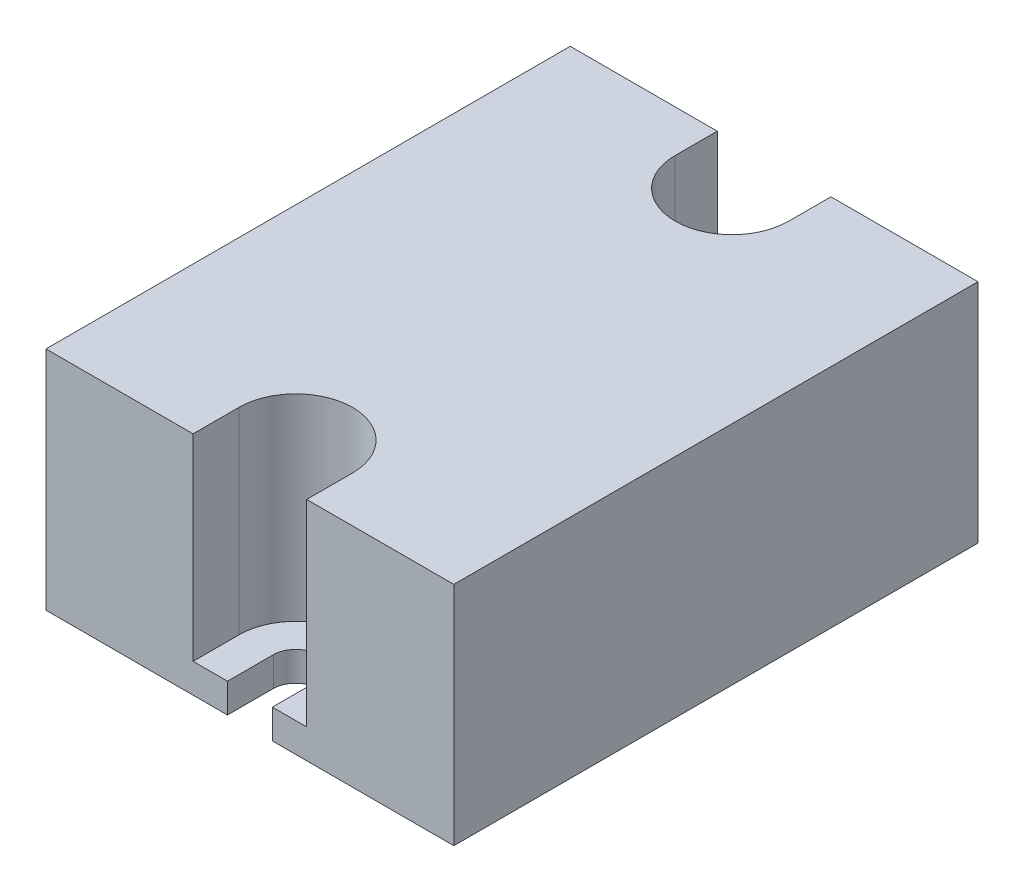
ISO-10303-21;
HEADER;
FILE_DESCRIPTION(('STEP AP214'),'2;1');
FILE_NAME('part.step','',(''),(''),'','','');
FILE_SCHEMA(('AUTOMOTIVE_DESIGN { 1 0 10303 214 1 1 1 1 }'));
ENDSEC;
DATA;
#1=APPLICATION_CONTEXT('core data for automotive mechanical design processes');
#2=APPLICATION_PROTOCOL_DEFINITION('international standard','automotive_design',2000,#1);
#3=PRODUCT_CONTEXT('',#1,'mechanical');
#4=PRODUCT('Part','Part','',(#3));
#5=PRODUCT_RELATED_PRODUCT_CATEGORY('part','',(#4));
#6=PRODUCT_DEFINITION_FORMATION('','',#4);
#7=PRODUCT_DEFINITION_CONTEXT('part definition',#1,'design');
#8=PRODUCT_DEFINITION('design','',#6,#7);
#9=PRODUCT_DEFINITION_SHAPE('','',#8);
#10=(LENGTH_UNIT() NAMED_UNIT(*) SI_UNIT(.MILLI.,.METRE.));
#11=(NAMED_UNIT(*) PLANE_ANGLE_UNIT() SI_UNIT($,.RADIAN.));
#12=(NAMED_UNIT(*) SI_UNIT($,.STERADIAN.) SOLID_ANGLE_UNIT());
#13=UNCERTAINTY_MEASURE_WITH_UNIT(LENGTH_MEASURE(1.E-05),#10,'distance_accuracy_value','');
#14=(GEOMETRIC_REPRESENTATION_CONTEXT(3) GLOBAL_UNCERTAINTY_ASSIGNED_CONTEXT((#13)) GLOBAL_UNIT_ASSIGNED_CONTEXT((#10,
#11,#12)) REPRESENTATION_CONTEXT('',''));
#15=CARTESIAN_POINT('',(0.,0.,0.));
#16=DIRECTION('',(0.,0.,1.));
#17=DIRECTION('',(1.,0.,0.));
#18=AXIS2_PLACEMENT_3D('',#15,#16,#17);
#19=CARTESIAN_POINT('',(22.25,3.19999999999998,-4.99999999999995));
#20=DIRECTION('',(0.,1.,0.));
#21=DIRECTION('',(0.,0.,1.));
#22=AXIS2_PLACEMENT_3D('',#19,#20,#21);
#23=PLANE('',#22);
#24=DIRECTION('',(0.,0.,-1.));
#25=VECTOR('',#24,1.);
#26=CARTESIAN_POINT('',(16.05,3.19999999999998,-57.2));
#27=LINE('',#26,#25);
#28=CARTESIAN_POINT('',(16.05,3.20000000000001,-52.6));
#29=VERTEX_POINT('',#28);
#30=CARTESIAN_POINT('',(16.05,3.19999999999998,-57.2));
#31=VERTEX_POINT('',#30);
#32=EDGE_CURVE('E60',#29,#31,#27,.T.);
#33=ORIENTED_EDGE('',*,*,#32,.F.);
#34=CARTESIAN_POINT('',(22.25,3.20000000000001,-52.5999999999999));
#35=DIRECTION('',(0.,-1.,0.));
#36=DIRECTION('',(0.,0.,1.));
#37=AXIS2_PLACEMENT_3D('',#34,#35,#36);
#38=CIRCLE('',#37,6.2);
#39=CARTESIAN_POINT('',(28.45,3.19999999999998,-52.6));
#40=VERTEX_POINT('',#39);
#41=EDGE_CURVE('E64',#40,#29,#38,.T.);
#42=ORIENTED_EDGE('',*,*,#41,.F.);
#43=DIRECTION('',(0.,0.,1.));
#44=VECTOR('',#43,1.);
#45=CARTESIAN_POINT('',(28.45,3.20000000000001,-57.2));
#46=LINE('',#45,#44);
#47=CARTESIAN_POINT('',(28.45,3.20000000000001,-57.2));
#48=VERTEX_POINT('',#47);
#49=EDGE_CURVE('E273',#48,#40,#46,.T.);
#50=ORIENTED_EDGE('',*,*,#49,.F.);
#51=DIRECTION('',(-1.,0.,0.));
#52=VECTOR('',#51,1.);
#53=CARTESIAN_POINT('',(44.5,3.19999999999998,-57.2));
#54=LINE('',#53,#52);
#55=EDGE_CURVE('E203',#48,#31,#54,.T.);
#56=ORIENTED_EDGE('',*,*,#55,.T.);
#57=EDGE_LOOP('',(#33,#42,#50,#56));
#58=FACE_BOUND('',#57,.T.);
#59=CARTESIAN_POINT('',(22.25,3.20000000000001,-52.5999999999999));
#60=DIRECTION('',(0.,1.,0.));
#61=DIRECTION('',(0.,0.,1.));
#62=AXIS2_PLACEMENT_3D('',#59,#60,#61);
#63=CIRCLE('',#62,2.45);
#64=CARTESIAN_POINT('',(22.25,3.20000000000001,-50.1499999999999));
#65=VERTEX_POINT('',#64);
#66=EDGE_CURVE('E184',#65,#65,#63,.T.);
#67=ORIENTED_EDGE('',*,*,#66,.F.);
#68=EDGE_LOOP('',(#67));
#69=FACE_BOUND('',#68,.T.);
#70=ADVANCED_FACE('F45',(#58,#69),#23,.T.);
#71=DIRECTION('',(0.,0.,1.));
#72=VECTOR('',#71,1.);
#73=CARTESIAN_POINT('',(28.45,3.19999999999998,0.));
#74=LINE('',#73,#72);
#75=CARTESIAN_POINT('',(28.45,3.20000000000001,-5.));
#76=VERTEX_POINT('',#75);
#77=CARTESIAN_POINT('',(28.45,3.19999999999998,0.));
#78=VERTEX_POINT('',#77);
#79=EDGE_CURVE('E267',#76,#78,#74,.T.);
#80=ORIENTED_EDGE('',*,*,#79,.F.);
#81=CARTESIAN_POINT('',(22.25,3.19999999999998,-4.99999999999995));
#82=DIRECTION('',(0.,-1.,0.));
#83=DIRECTION('',(0.,0.,-1.));
#84=AXIS2_PLACEMENT_3D('',#81,#82,#83);
#85=CIRCLE('',#84,6.2);
#86=CARTESIAN_POINT('',(16.05,3.19999999999998,-4.99999999999995));
#87=VERTEX_POINT('',#86);
#88=EDGE_CURVE('E265',#87,#76,#85,.T.);
#89=ORIENTED_EDGE('',*,*,#88,.F.);
#90=DIRECTION('',(0.,0.,-1.));
#91=VECTOR('',#90,1.);
#92=CARTESIAN_POINT('',(16.05,3.20000000000001,0.));
#93=LINE('',#92,#91);
#94=CARTESIAN_POINT('',(16.05,3.20000000000001,0.));
#95=VERTEX_POINT('',#94);
#96=EDGE_CURVE('E263',#95,#87,#93,.T.);
#97=ORIENTED_EDGE('',*,*,#96,.F.);
#98=DIRECTION('',(1.,0.,0.));
#99=VECTOR('',#98,1.);
#100=CARTESIAN_POINT('',(0.,3.20000000000001,0.));
#101=LINE('',#100,#99);
#102=CARTESIAN_POINT('',(19.8,3.20000000000001,0.));
#103=VERTEX_POINT('',#102);
#104=EDGE_CURVE('E180',#95,#103,#101,.T.);
#105=ORIENTED_EDGE('',*,*,#104,.T.);
#106=DIRECTION('',(0.,0.,-1.));
#107=VECTOR('',#106,1.);
#108=CARTESIAN_POINT('',(19.8,3.20000000000001,0.));
#109=LINE('',#108,#107);
#110=CARTESIAN_POINT('',(19.8,3.20000000000001,-4.99999999999995));
#111=VERTEX_POINT('',#110);
#112=EDGE_CURVE('E194',#103,#111,#109,.T.);
#113=ORIENTED_EDGE('',*,*,#112,.T.);
#114=CARTESIAN_POINT('',(22.25,3.19999999999998,-4.99999999999995));
#115=DIRECTION('',(0.,-1.,0.));
#116=DIRECTION('',(0.,0.,1.));
#117=AXIS2_PLACEMENT_3D('',#114,#115,#116);
#118=CIRCLE('',#117,2.45);
#119=CARTESIAN_POINT('',(24.7,3.19999999999998,-4.99999999999995));
#120=VERTEX_POINT('',#119);
#121=EDGE_CURVE('E197',#111,#120,#118,.T.);
#122=ORIENTED_EDGE('',*,*,#121,.T.);
#123=DIRECTION('',(0.,0.,1.));
#124=VECTOR('',#123,1.);
#125=CARTESIAN_POINT('',(24.7,3.20000000000001,0.));
#126=LINE('',#125,#124);
#127=CARTESIAN_POINT('',(24.7,3.20000000000001,0.));
#128=VERTEX_POINT('',#127);
#129=EDGE_CURVE('E199',#120,#128,#126,.T.);
#130=ORIENTED_EDGE('',*,*,#129,.T.);
#131=DIRECTION('',(1.,0.,0.));
#132=VECTOR('',#131,1.);
#133=CARTESIAN_POINT('',(44.5,3.20000000000001,0.));
#134=LINE('',#133,#132);
#135=EDGE_CURVE('E201',#128,#78,#134,.T.);
#136=ORIENTED_EDGE('',*,*,#135,.T.);
#137=EDGE_LOOP('',(#80,#89,#97,#105,#113,#122,#130,#136));
#138=FACE_BOUND('',#137,.T.);
#139=ADVANCED_FACE('F261',(#138),#23,.T.);
#140=CARTESIAN_POINT('',(22.25,0.,-5.));
#141=DIRECTION('',(0.,1.,0.));
#142=DIRECTION('',(0.,0.,1.));
#143=AXIS2_PLACEMENT_3D('',#140,#141,#142);
#144=PLANE('',#143);
#145=DIRECTION('',(0.,0.,1.));
#146=VECTOR('',#145,1.);
#147=CARTESIAN_POINT('',(0.,0.,0.));
#148=LINE('',#147,#146);
#149=CARTESIAN_POINT('',(0.,0.,-57.2));
#150=VERTEX_POINT('',#149);
#151=CARTESIAN_POINT('',(0.,0.,0.));
#152=VERTEX_POINT('',#151);
#153=EDGE_CURVE('E191',#150,#152,#148,.T.);
#154=ORIENTED_EDGE('',*,*,#153,.F.);
#155=DIRECTION('',(-1.,0.,0.));
#156=VECTOR('',#155,1.);
#157=CARTESIAN_POINT('',(0.,0.,-57.2));
#158=LINE('',#157,#156);
#159=CARTESIAN_POINT('',(44.5,0.,-57.2));
#160=VERTEX_POINT('',#159);
#161=EDGE_CURVE('E195',#160,#150,#158,.T.);
#162=ORIENTED_EDGE('',*,*,#161,.F.);
#163=DIRECTION('',(0.,0.,-1.));
#164=VECTOR('',#163,1.);
#165=CARTESIAN_POINT('',(44.5,0.,0.));
#166=LINE('',#165,#164);
#167=CARTESIAN_POINT('',(44.5,0.,0.));
#168=VERTEX_POINT('',#167);
#169=EDGE_CURVE('E218',#168,#160,#166,.T.);
#170=ORIENTED_EDGE('',*,*,#169,.F.);
#171=DIRECTION('',(1.,0.,0.));
#172=VECTOR('',#171,1.);
#173=CARTESIAN_POINT('',(44.5,0.,0.));
#174=LINE('',#173,#172);
#175=CARTESIAN_POINT('',(24.7,0.,0.));
#176=VERTEX_POINT('',#175);
#177=EDGE_CURVE('E216',#176,#168,#174,.T.);
#178=ORIENTED_EDGE('',*,*,#177,.F.);
#179=DIRECTION('',(0.,0.,1.));
#180=VECTOR('',#179,1.);
#181=CARTESIAN_POINT('',(24.7,0.,0.));
#182=LINE('',#181,#180);
#183=CARTESIAN_POINT('',(24.7,0.,-4.99999999999995));
#184=VERTEX_POINT('',#183);
#185=EDGE_CURVE('E214',#184,#176,#182,.T.);
#186=ORIENTED_EDGE('',*,*,#185,.F.);
#187=CARTESIAN_POINT('',(22.25,0.,-5.));
#188=DIRECTION('',(0.,-1.,0.));
#189=DIRECTION('',(0.,0.,1.));
#190=AXIS2_PLACEMENT_3D('',#187,#188,#189);
#191=CIRCLE('',#190,2.45);
#192=CARTESIAN_POINT('',(19.8,0.,-5.));
#193=VERTEX_POINT('',#192);
#194=EDGE_CURVE('E212',#193,#184,#191,.T.);
#195=ORIENTED_EDGE('',*,*,#194,.F.);
#196=DIRECTION('',(0.,0.,-1.));
#197=VECTOR('',#196,1.);
#198=CARTESIAN_POINT('',(19.8,0.,0.));
#199=LINE('',#198,#197);
#200=CARTESIAN_POINT('',(19.8,0.,0.));
#201=VERTEX_POINT('',#200);
#202=EDGE_CURVE('E210',#201,#193,#199,.T.);
#203=ORIENTED_EDGE('',*,*,#202,.F.);
#204=DIRECTION('',(1.,0.,0.));
#205=VECTOR('',#204,1.);
#206=CARTESIAN_POINT('',(0.,0.,0.));
#207=LINE('',#206,#205);
#208=EDGE_CURVE('E208',#152,#201,#207,.T.);
#209=ORIENTED_EDGE('',*,*,#208,.F.);
#210=EDGE_LOOP('',(#154,#162,#170,#178,#186,#195,#203,#209));
#211=FACE_BOUND('',#210,.T.);
#212=CARTESIAN_POINT('',(22.25,0.,-52.6));
#213=DIRECTION('',(0.,1.,0.));
#214=DIRECTION('',(0.,0.,1.));
#215=AXIS2_PLACEMENT_3D('',#212,#213,#214);
#216=CIRCLE('',#215,2.45);
#217=CARTESIAN_POINT('',(22.25,0.,-50.15));
#218=VERTEX_POINT('',#217);
#219=EDGE_CURVE('E181',#218,#218,#216,.T.);
#220=ORIENTED_EDGE('',*,*,#219,.T.);
#221=EDGE_LOOP('',(#220));
#222=FACE_BOUND('',#221,.T.);
#223=ADVANCED_FACE('F247',(#211,#222),#144,.F.);
#224=CARTESIAN_POINT('',(0.,3.20000000000001,0.));
#225=DIRECTION('',(1.,0.,0.));
#226=DIRECTION('',(0.,0.,-1.));
#227=AXIS2_PLACEMENT_3D('',#224,#225,#226);
#228=PLANE('',#227);
#229=ORIENTED_EDGE('',*,*,#153,.T.);
#230=DIRECTION('',(0.,-1.,0.));
#231=VECTOR('',#230,1.);
#232=CARTESIAN_POINT('',(0.,3.20000000000001,0.));
#233=LINE('',#232,#231);
#234=CARTESIAN_POINT('',(0.,24.7,0.));
#235=VERTEX_POINT('',#234);
#236=EDGE_CURVE('E11',#235,#152,#233,.T.);
#237=ORIENTED_EDGE('',*,*,#236,.F.);
#238=DIRECTION('',(0.,0.,1.));
#239=VECTOR('',#238,1.);
#240=CARTESIAN_POINT('',(0.,24.7,0.));
#241=LINE('',#240,#239);
#242=CARTESIAN_POINT('',(0.,24.7,-57.2));
#243=VERTEX_POINT('',#242);
#244=EDGE_CURVE('E174',#243,#235,#241,.T.);
#245=ORIENTED_EDGE('',*,*,#244,.F.);
#246=DIRECTION('',(0.,-1.,0.));
#247=VECTOR('',#246,1.);
#248=CARTESIAN_POINT('',(0.,3.19999999999998,-57.2));
#249=LINE('',#248,#247);
#250=EDGE_CURVE('E205',#243,#150,#249,.T.);
#251=ORIENTED_EDGE('',*,*,#250,.T.);
#252=EDGE_LOOP('',(#229,#237,#245,#251));
#253=FACE_BOUND('',#252,.T.);
#254=ADVANCED_FACE('F47',(#253),#228,.F.);
#255=CARTESIAN_POINT('',(0.,3.20000000000001,0.));
#256=DIRECTION('',(0.,0.,-1.));
#257=DIRECTION('',(-1.,0.,0.));
#258=AXIS2_PLACEMENT_3D('',#255,#256,#257);
#259=PLANE('',#258);
#260=ORIENTED_EDGE('',*,*,#208,.T.);
#261=DIRECTION('',(0.,-1.,0.));
#262=VECTOR('',#261,1.);
#263=CARTESIAN_POINT('',(19.8,3.20000000000001,0.));
#264=LINE('',#263,#262);
#265=EDGE_CURVE('E53',#103,#201,#264,.T.);
#266=ORIENTED_EDGE('',*,*,#265,.F.);
#267=ORIENTED_EDGE('',*,*,#104,.F.);
#268=DIRECTION('',(0.,-1.,0.));
#269=VECTOR('',#268,1.);
#270=CARTESIAN_POINT('',(16.05,24.7,0.));
#271=LINE('',#270,#269);
#272=CARTESIAN_POINT('',(16.05,24.7,0.));
#273=VERTEX_POINT('',#272);
#274=EDGE_CURVE('E161',#273,#95,#271,.T.);
#275=ORIENTED_EDGE('',*,*,#274,.F.);
#276=DIRECTION('',(1.,0.,0.));
#277=VECTOR('',#276,1.);
#278=CARTESIAN_POINT('',(0.,24.7,0.));
#279=LINE('',#278,#277);
#280=EDGE_CURVE('E167',#235,#273,#279,.T.);
#281=ORIENTED_EDGE('',*,*,#280,.F.);
#282=ORIENTED_EDGE('',*,*,#236,.T.);
#283=EDGE_LOOP('',(#260,#266,#267,#275,#281,#282));
#284=FACE_BOUND('',#283,.T.);
#285=ADVANCED_FACE('F178',(#284),#259,.F.);
#286=CARTESIAN_POINT('',(19.8,3.20000000000001,0.));
#287=DIRECTION('',(-1.,0.,0.));
#288=DIRECTION('',(0.,0.,1.));
#289=AXIS2_PLACEMENT_3D('',#286,#287,#288);
#290=PLANE('',#289);
#291=ORIENTED_EDGE('',*,*,#202,.T.);
#292=DIRECTION('',(0.,-1.,0.));
#293=VECTOR('',#292,1.);
#294=CARTESIAN_POINT('',(19.8,3.20000000000001,-4.99999999999995));
#295=LINE('',#294,#293);
#296=EDGE_CURVE('E236',#111,#193,#295,.T.);
#297=ORIENTED_EDGE('',*,*,#296,.F.);
#298=ORIENTED_EDGE('',*,*,#112,.F.);
#299=ORIENTED_EDGE('',*,*,#265,.T.);
#300=EDGE_LOOP('',(#291,#297,#298,#299));
#301=FACE_BOUND('',#300,.T.);
#302=ADVANCED_FACE('F242',(#301),#290,.F.);
#303=CARTESIAN_POINT('',(22.25,3.19999999999998,-4.99999999999995));
#304=DIRECTION('',(0.,-1.,0.));
#305=DIRECTION('',(0.,0.,-1.));
#306=AXIS2_PLACEMENT_3D('',#303,#304,#305);
#307=CYLINDRICAL_SURFACE('',#306,2.45);
#308=ORIENTED_EDGE('',*,*,#194,.T.);
#309=DIRECTION('',(0.,-1.,0.));
#310=VECTOR('',#309,1.);
#311=CARTESIAN_POINT('',(24.7,3.19999999999998,-4.99999999999995));
#312=LINE('',#311,#310);
#313=EDGE_CURVE('E233',#120,#184,#312,.T.);
#314=ORIENTED_EDGE('',*,*,#313,.F.);
#315=ORIENTED_EDGE('',*,*,#121,.F.);
#316=ORIENTED_EDGE('',*,*,#296,.T.);
#317=EDGE_LOOP('',(#308,#314,#315,#316));
#318=FACE_BOUND('',#317,.T.);
#319=ADVANCED_FACE('F253',(#318),#307,.F.);
#320=CARTESIAN_POINT('',(24.7,3.20000000000001,0.));
#321=DIRECTION('',(1.,0.,0.));
#322=DIRECTION('',(0.,0.,-1.));
#323=AXIS2_PLACEMENT_3D('',#320,#321,#322);
#324=PLANE('',#323);
#325=ORIENTED_EDGE('',*,*,#185,.T.);
#326=DIRECTION('',(0.,-1.,0.));
#327=VECTOR('',#326,1.);
#328=CARTESIAN_POINT('',(24.7,3.20000000000001,0.));
#329=LINE('',#328,#327);
#330=EDGE_CURVE('E230',#128,#176,#329,.T.);
#331=ORIENTED_EDGE('',*,*,#330,.F.);
#332=ORIENTED_EDGE('',*,*,#129,.F.);
#333=ORIENTED_EDGE('',*,*,#313,.T.);
#334=EDGE_LOOP('',(#325,#331,#332,#333));
#335=FACE_BOUND('',#334,.T.);
#336=ADVANCED_FACE('F257',(#335),#324,.F.);
#337=CARTESIAN_POINT('',(44.5,3.20000000000001,0.));
#338=DIRECTION('',(0.,0.,-1.));
#339=DIRECTION('',(-1.,0.,0.));
#340=AXIS2_PLACEMENT_3D('',#337,#338,#339);
#341=PLANE('',#340);
#342=ORIENTED_EDGE('',*,*,#177,.T.);
#343=DIRECTION('',(0.,-1.,0.));
#344=VECTOR('',#343,1.);
#345=CARTESIAN_POINT('',(44.5,3.20000000000001,0.));
#346=LINE('',#345,#344);
#347=CARTESIAN_POINT('',(44.5,24.7,0.));
#348=VERTEX_POINT('',#347);
#349=EDGE_CURVE('E227',#348,#168,#346,.T.);
#350=ORIENTED_EDGE('',*,*,#349,.F.);
#351=DIRECTION('',(1.,0.,0.));
#352=VECTOR('',#351,1.);
#353=CARTESIAN_POINT('',(44.5,24.7,0.));
#354=LINE('',#353,#352);
#355=CARTESIAN_POINT('',(28.45,24.7,0.));
#356=VERTEX_POINT('',#355);
#357=EDGE_CURVE('E301',#356,#348,#354,.T.);
#358=ORIENTED_EDGE('',*,*,#357,.F.);
#359=DIRECTION('',(0.,-1.,0.));
#360=VECTOR('',#359,1.);
#361=CARTESIAN_POINT('',(28.45,24.7,0.));
#362=LINE('',#361,#360);
#363=EDGE_CURVE('E289',#356,#78,#362,.T.);
#364=ORIENTED_EDGE('',*,*,#363,.T.);
#365=ORIENTED_EDGE('',*,*,#135,.F.);
#366=ORIENTED_EDGE('',*,*,#330,.T.);
#367=EDGE_LOOP('',(#342,#350,#358,#364,#365,#366));
#368=FACE_BOUND('',#367,.T.);
#369=ADVANCED_FACE('F334',(#368),#341,.F.);
#370=CARTESIAN_POINT('',(44.5,3.20000000000001,0.));
#371=DIRECTION('',(-1.,0.,0.));
#372=DIRECTION('',(0.,0.,1.));
#373=AXIS2_PLACEMENT_3D('',#370,#371,#372);
#374=PLANE('',#373);
#375=ORIENTED_EDGE('',*,*,#169,.T.);
#376=DIRECTION('',(0.,-1.,0.));
#377=VECTOR('',#376,1.);
#378=CARTESIAN_POINT('',(44.5,3.19999999999998,-57.2));
#379=LINE('',#378,#377);
#380=CARTESIAN_POINT('',(44.5,24.7,-57.2));
#381=VERTEX_POINT('',#380);
#382=EDGE_CURVE('E224',#381,#160,#379,.T.);
#383=ORIENTED_EDGE('',*,*,#382,.F.);
#384=DIRECTION('',(0.,0.,-1.));
#385=VECTOR('',#384,1.);
#386=CARTESIAN_POINT('',(44.5,24.7,0.));
#387=LINE('',#386,#385);
#388=EDGE_CURVE('E306',#348,#381,#387,.T.);
#389=ORIENTED_EDGE('',*,*,#388,.F.);
#390=ORIENTED_EDGE('',*,*,#349,.T.);
#391=EDGE_LOOP('',(#375,#383,#389,#390));
#392=FACE_BOUND('',#391,.T.);
#393=ADVANCED_FACE('F324',(#392),#374,.F.);
#394=CARTESIAN_POINT('',(0.,3.19999999999998,-57.2));
#395=DIRECTION('',(0.,0.,1.));
#396=DIRECTION('',(1.,0.,0.));
#397=AXIS2_PLACEMENT_3D('',#394,#395,#396);
#398=PLANE('',#397);
#399=ORIENTED_EDGE('',*,*,#161,.T.);
#400=ORIENTED_EDGE('',*,*,#250,.F.);
#401=DIRECTION('',(-1.,0.,0.));
#402=VECTOR('',#401,1.);
#403=CARTESIAN_POINT('',(0.,24.7,-57.2));
#404=LINE('',#403,#402);
#405=CARTESIAN_POINT('',(16.05,24.7,-57.2));
#406=VERTEX_POINT('',#405);
#407=EDGE_CURVE('E316',#406,#243,#404,.T.);
#408=ORIENTED_EDGE('',*,*,#407,.F.);
#409=DIRECTION('',(0.,-1.,0.));
#410=VECTOR('',#409,1.);
#411=CARTESIAN_POINT('',(16.05,24.7,-57.2));
#412=LINE('',#411,#410);
#413=EDGE_CURVE('E277',#406,#31,#412,.T.);
#414=ORIENTED_EDGE('',*,*,#413,.T.);
#415=ORIENTED_EDGE('',*,*,#55,.F.);
#416=DIRECTION('',(0.,-1.,0.));
#417=VECTOR('',#416,1.);
#418=CARTESIAN_POINT('',(28.45,24.7,-57.2));
#419=LINE('',#418,#417);
#420=CARTESIAN_POINT('',(28.45,24.7,-57.2));
#421=VERTEX_POINT('',#420);
#422=EDGE_CURVE('E286',#421,#48,#419,.T.);
#423=ORIENTED_EDGE('',*,*,#422,.F.);
#424=DIRECTION('',(-1.,0.,0.));
#425=VECTOR('',#424,1.);
#426=CARTESIAN_POINT('',(44.5,24.7,-57.2));
#427=LINE('',#426,#425);
#428=EDGE_CURVE('E309',#381,#421,#427,.T.);
#429=ORIENTED_EDGE('',*,*,#428,.F.);
#430=ORIENTED_EDGE('',*,*,#382,.T.);
#431=EDGE_LOOP('',(#399,#400,#408,#414,#415,#423,#429,#430));
#432=FACE_BOUND('',#431,.T.);
#433=ADVANCED_FACE('F327',(#432),#398,.F.);
#434=CARTESIAN_POINT('',(22.25,3.20000000000001,-52.5999999999999));
#435=DIRECTION('',(0.,-1.,0.));
#436=DIRECTION('',(0.,0.,-1.));
#437=AXIS2_PLACEMENT_3D('',#434,#435,#436);
#438=CYLINDRICAL_SURFACE('',#437,2.45);
#439=ORIENTED_EDGE('',*,*,#66,.T.);
#440=EDGE_LOOP('',(#439));
#441=FACE_BOUND('',#440,.T.);
#442=ORIENTED_EDGE('',*,*,#219,.F.);
#443=EDGE_LOOP('',(#442));
#444=FACE_BOUND('',#443,.T.);
#445=ADVANCED_FACE('F351',(#441,#444),#438,.F.);
#446=CARTESIAN_POINT('',(16.05,24.7,0.));
#447=DIRECTION('',(-1.,0.,0.));
#448=DIRECTION('',(0.,0.,1.));
#449=AXIS2_PLACEMENT_3D('',#446,#447,#448);
#450=PLANE('',#449);
#451=ORIENTED_EDGE('',*,*,#96,.T.);
#452=DIRECTION('',(0.,-1.,0.));
#453=VECTOR('',#452,1.);
#454=CARTESIAN_POINT('',(16.05,24.7,-4.99999999999995));
#455=LINE('',#454,#453);
#456=CARTESIAN_POINT('',(16.05,24.7,-4.99999999999995));
#457=VERTEX_POINT('',#456);
#458=EDGE_CURVE('E163',#457,#87,#455,.T.);
#459=ORIENTED_EDGE('',*,*,#458,.F.);
#460=DIRECTION('',(0.,0.,-1.));
#461=VECTOR('',#460,1.);
#462=CARTESIAN_POINT('',(16.05,24.7,0.));
#463=LINE('',#462,#461);
#464=EDGE_CURVE('E156',#273,#457,#463,.T.);
#465=ORIENTED_EDGE('',*,*,#464,.F.);
#466=ORIENTED_EDGE('',*,*,#274,.T.);
#467=EDGE_LOOP('',(#451,#459,#465,#466));
#468=FACE_BOUND('',#467,.T.);
#469=ADVANCED_FACE('F159',(#468),#450,.F.);
#470=CARTESIAN_POINT('',(22.25,24.7,-4.99999999999995));
#471=DIRECTION('',(0.,-1.,0.));
#472=DIRECTION('',(0.,0.,-1.));
#473=AXIS2_PLACEMENT_3D('',#470,#471,#472);
#474=CYLINDRICAL_SURFACE('',#473,6.2);
#475=ORIENTED_EDGE('',*,*,#88,.T.);
#476=DIRECTION('',(0.,-1.,0.));
#477=VECTOR('',#476,1.);
#478=CARTESIAN_POINT('',(28.45,24.7,-5.));
#479=LINE('',#478,#477);
#480=CARTESIAN_POINT('',(28.45,24.7,-5.));
#481=VERTEX_POINT('',#480);
#482=EDGE_CURVE('E186',#481,#76,#479,.T.);
#483=ORIENTED_EDGE('',*,*,#482,.F.);
#484=CARTESIAN_POINT('',(22.25,24.7,-4.99999999999995));
#485=DIRECTION('',(0.,-1.,0.));
#486=DIRECTION('',(0.,0.,-1.));
#487=AXIS2_PLACEMENT_3D('',#484,#485,#486);
#488=CIRCLE('',#487,6.2);
#489=EDGE_CURVE('E166',#457,#481,#488,.T.);
#490=ORIENTED_EDGE('',*,*,#489,.F.);
#491=ORIENTED_EDGE('',*,*,#458,.T.);
#492=EDGE_LOOP('',(#475,#483,#490,#491));
#493=FACE_BOUND('',#492,.T.);
#494=ADVANCED_FACE('F299',(#493),#474,.F.);
#495=CARTESIAN_POINT('',(28.45,24.7,0.));
#496=DIRECTION('',(1.,0.,0.));
#497=DIRECTION('',(0.,0.,-1.));
#498=AXIS2_PLACEMENT_3D('',#495,#496,#497);
#499=PLANE('',#498);
#500=ORIENTED_EDGE('',*,*,#79,.T.);
#501=ORIENTED_EDGE('',*,*,#363,.F.);
#502=DIRECTION('',(0.,0.,1.));
#503=VECTOR('',#502,1.);
#504=CARTESIAN_POINT('',(28.45,24.7,0.));
#505=LINE('',#504,#503);
#506=EDGE_CURVE('E297',#481,#356,#505,.T.);
#507=ORIENTED_EDGE('',*,*,#506,.F.);
#508=ORIENTED_EDGE('',*,*,#482,.T.);
#509=EDGE_LOOP('',(#500,#501,#507,#508));
#510=FACE_BOUND('',#509,.T.);
#511=ADVANCED_FACE('F295',(#510),#499,.F.);
#512=CARTESIAN_POINT('',(28.45,24.7,-57.2));
#513=DIRECTION('',(1.,0.,0.));
#514=DIRECTION('',(0.,0.,-1.));
#515=AXIS2_PLACEMENT_3D('',#512,#513,#514);
#516=PLANE('',#515);
#517=ORIENTED_EDGE('',*,*,#49,.T.);
#518=DIRECTION('',(0.,-1.,0.));
#519=VECTOR('',#518,1.);
#520=CARTESIAN_POINT('',(28.45,24.7,-52.6));
#521=LINE('',#520,#519);
#522=CARTESIAN_POINT('',(28.45,24.7,-52.6));
#523=VERTEX_POINT('',#522);
#524=EDGE_CURVE('E283',#523,#40,#521,.T.);
#525=ORIENTED_EDGE('',*,*,#524,.F.);
#526=DIRECTION('',(0.,0.,1.));
#527=VECTOR('',#526,1.);
#528=CARTESIAN_POINT('',(28.45,24.7,-57.2));
#529=LINE('',#528,#527);
#530=EDGE_CURVE('E311',#421,#523,#529,.T.);
#531=ORIENTED_EDGE('',*,*,#530,.F.);
#532=ORIENTED_EDGE('',*,*,#422,.T.);
#533=EDGE_LOOP('',(#517,#525,#531,#532));
#534=FACE_BOUND('',#533,.T.);
#535=ADVANCED_FACE('F373',(#534),#516,.F.);
#536=CARTESIAN_POINT('',(22.25,24.7,-52.6));
#537=DIRECTION('',(0.,-1.,0.));
#538=DIRECTION('',(0.,0.,-1.));
#539=AXIS2_PLACEMENT_3D('',#536,#537,#538);
#540=CYLINDRICAL_SURFACE('',#539,6.2);
#541=ORIENTED_EDGE('',*,*,#41,.T.);
#542=DIRECTION('',(0.,-1.,0.));
#543=VECTOR('',#542,1.);
#544=CARTESIAN_POINT('',(16.05,24.7,-52.6));
#545=LINE('',#544,#543);
#546=CARTESIAN_POINT('',(16.05,24.7,-52.6));
#547=VERTEX_POINT('',#546);
#548=EDGE_CURVE('E280',#547,#29,#545,.T.);
#549=ORIENTED_EDGE('',*,*,#548,.F.);
#550=CARTESIAN_POINT('',(22.25,24.7,-52.6));
#551=DIRECTION('',(0.,-1.,0.));
#552=DIRECTION('',(0.,0.,1.));
#553=AXIS2_PLACEMENT_3D('',#550,#551,#552);
#554=CIRCLE('',#553,6.2);
#555=EDGE_CURVE('E313',#523,#547,#554,.T.);
#556=ORIENTED_EDGE('',*,*,#555,.F.);
#557=ORIENTED_EDGE('',*,*,#524,.T.);
#558=EDGE_LOOP('',(#541,#549,#556,#557));
#559=FACE_BOUND('',#558,.T.);
#560=ADVANCED_FACE('F376',(#559),#540,.F.);
#561=CARTESIAN_POINT('',(16.05,24.7,-57.2));
#562=DIRECTION('',(-1.,0.,0.));
#563=DIRECTION('',(0.,0.,1.));
#564=AXIS2_PLACEMENT_3D('',#561,#562,#563);
#565=PLANE('',#564);
#566=ORIENTED_EDGE('',*,*,#32,.T.);
#567=ORIENTED_EDGE('',*,*,#413,.F.);
#568=DIRECTION('',(0.,0.,-1.));
#569=VECTOR('',#568,1.);
#570=CARTESIAN_POINT('',(16.05,24.7,-57.2));
#571=LINE('',#570,#569);
#572=EDGE_CURVE('E315',#547,#406,#571,.T.);
#573=ORIENTED_EDGE('',*,*,#572,.F.);
#574=ORIENTED_EDGE('',*,*,#548,.T.);
#575=EDGE_LOOP('',(#566,#567,#573,#574));
#576=FACE_BOUND('',#575,.T.);
#577=ADVANCED_FACE('F380',(#576),#565,.F.);
#578=CARTESIAN_POINT('',(22.25,24.7,-4.99999999999995));
#579=DIRECTION('',(0.,-1.,0.));
#580=DIRECTION('',(0.,0.,-1.));
#581=AXIS2_PLACEMENT_3D('',#578,#579,#580);
#582=PLANE('',#581);
#583=ORIENTED_EDGE('',*,*,#280,.T.);
#584=ORIENTED_EDGE('',*,*,#464,.T.);
#585=ORIENTED_EDGE('',*,*,#489,.T.);
#586=ORIENTED_EDGE('',*,*,#506,.T.);
#587=ORIENTED_EDGE('',*,*,#357,.T.);
#588=ORIENTED_EDGE('',*,*,#388,.T.);
#589=ORIENTED_EDGE('',*,*,#428,.T.);
#590=ORIENTED_EDGE('',*,*,#530,.T.);
#591=ORIENTED_EDGE('',*,*,#555,.T.);
#592=ORIENTED_EDGE('',*,*,#572,.T.);
#593=ORIENTED_EDGE('',*,*,#407,.T.);
#594=ORIENTED_EDGE('',*,*,#244,.T.);
#595=EDGE_LOOP('',(#583,#584,#585,#586,#587,#588,#589,#590,#591,#592,#593,#594));
#596=FACE_BOUND('',#595,.T.);
#597=ADVANCED_FACE('F171',(#596),#582,.F.);
#598=CLOSED_SHELL('',(#70,#139,#223,#254,#285,#302,#319,#336,#369,#393,#433,#445,#469,#494,#511,
#535,#560,#577,#597));
#599=MANIFOLD_SOLID_BREP('B2',#598);
#600=ADVANCED_BREP_SHAPE_REPRESENTATION('',(#18,#599),#14);
#601=SHAPE_DEFINITION_REPRESENTATION(#9,#600);
ENDSEC;
END-ISO-10303-21;
